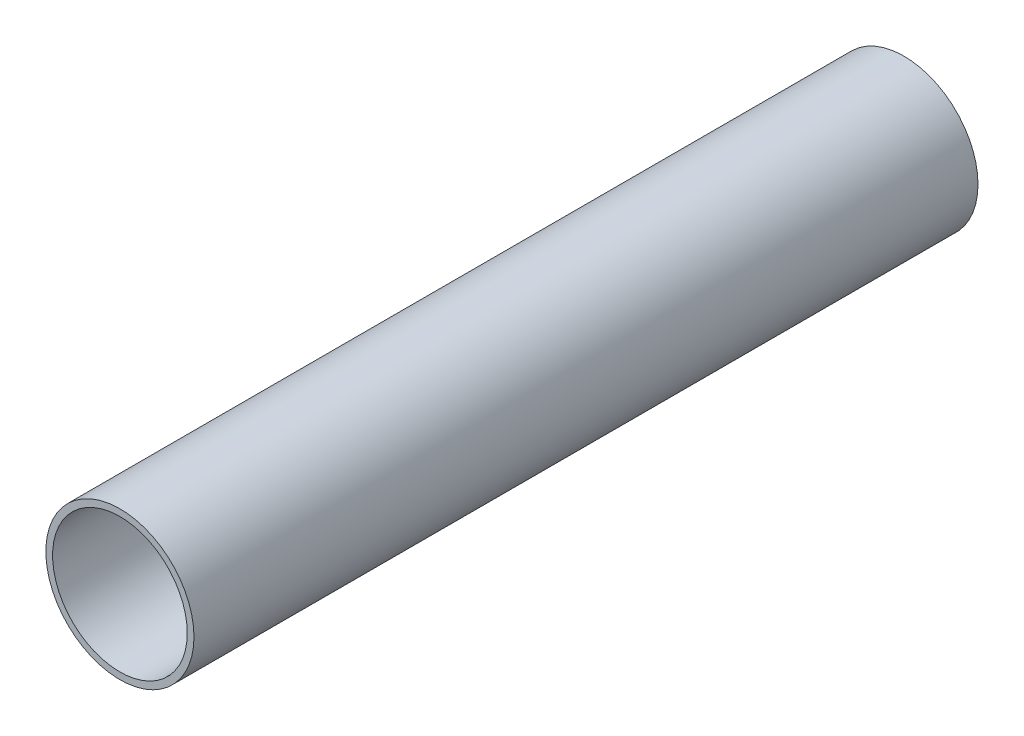
ISO-10303-21;
HEADER;
FILE_DESCRIPTION(('STEP AP214'),'2;1');
FILE_NAME('part.step','',(''),(''),'','','');
FILE_SCHEMA(('AUTOMOTIVE_DESIGN { 1 0 10303 214 1 1 1 1 }'));
ENDSEC;
DATA;
#1=APPLICATION_CONTEXT('core data for automotive mechanical design processes');
#2=APPLICATION_PROTOCOL_DEFINITION('international standard','automotive_design',2000,#1);
#3=PRODUCT_CONTEXT('',#1,'mechanical');
#4=PRODUCT('Part','Part','',(#3));
#5=PRODUCT_RELATED_PRODUCT_CATEGORY('part','',(#4));
#6=PRODUCT_DEFINITION_FORMATION('','',#4);
#7=PRODUCT_DEFINITION_CONTEXT('part definition',#1,'design');
#8=PRODUCT_DEFINITION('design','',#6,#7);
#9=PRODUCT_DEFINITION_SHAPE('','',#8);
#10=(LENGTH_UNIT() NAMED_UNIT(*) SI_UNIT(.MILLI.,.METRE.));
#11=(NAMED_UNIT(*) PLANE_ANGLE_UNIT() SI_UNIT($,.RADIAN.));
#12=(NAMED_UNIT(*) SI_UNIT($,.STERADIAN.) SOLID_ANGLE_UNIT());
#13=UNCERTAINTY_MEASURE_WITH_UNIT(LENGTH_MEASURE(1.E-05),#10,'distance_accuracy_value','');
#14=(GEOMETRIC_REPRESENTATION_CONTEXT(3) GLOBAL_UNCERTAINTY_ASSIGNED_CONTEXT((#13)) GLOBAL_UNIT_ASSIGNED_CONTEXT((#10,
#11,#12)) REPRESENTATION_CONTEXT('',''));
#15=CARTESIAN_POINT('',(0.,0.,0.));
#16=DIRECTION('',(0.,0.,1.));
#17=DIRECTION('',(1.,0.,0.));
#18=AXIS2_PLACEMENT_3D('',#15,#16,#17);
#19=CARTESIAN_POINT('',(0.,0.,73.95));
#20=DIRECTION('',(0.,0.,1.));
#21=DIRECTION('',(1.,0.,0.));
#22=AXIS2_PLACEMENT_3D('',#19,#20,#21);
#23=PLANE('',#22);
#24=CARTESIAN_POINT('',(0.,0.,73.95));
#25=DIRECTION('',(0.,0.,1.));
#26=DIRECTION('',(1.,0.,0.));
#27=AXIS2_PLACEMENT_3D('',#24,#25,#26);
#28=CIRCLE('',#27,13.97);
#29=CARTESIAN_POINT('',(13.97,0.,73.95));
#30=VERTEX_POINT('',#29);
#31=EDGE_CURVE('E10',#30,#30,#28,.T.);
#32=ORIENTED_EDGE('',*,*,#31,.T.);
#33=EDGE_LOOP('',(#32));
#34=FACE_BOUND('',#33,.T.);
#35=CARTESIAN_POINT('',(0.,0.,73.95));
#36=DIRECTION('',(0.,0.,1.));
#37=DIRECTION('',(1.,0.,0.));
#38=AXIS2_PLACEMENT_3D('',#35,#36,#37);
#39=CIRCLE('',#38,12.7);
#40=CARTESIAN_POINT('',(12.7,0.,73.95));
#41=VERTEX_POINT('',#40);
#42=EDGE_CURVE('E43',#41,#41,#39,.T.);
#43=ORIENTED_EDGE('',*,*,#42,.F.);
#44=EDGE_LOOP('',(#43));
#45=FACE_BOUND('',#44,.T.);
#46=ADVANCED_FACE('F32',(#34,#45),#23,.T.);
#47=CARTESIAN_POINT('',(0.,0.,-73.95));
#48=DIRECTION('',(0.,0.,1.));
#49=DIRECTION('',(1.,0.,0.));
#50=AXIS2_PLACEMENT_3D('',#47,#48,#49);
#51=PLANE('',#50);
#52=CARTESIAN_POINT('',(0.,0.,-73.95));
#53=DIRECTION('',(0.,0.,1.));
#54=DIRECTION('',(1.,0.,0.));
#55=AXIS2_PLACEMENT_3D('',#52,#53,#54);
#56=CIRCLE('',#55,13.97);
#57=CARTESIAN_POINT('',(13.97,0.,-73.95));
#58=VERTEX_POINT('',#57);
#59=EDGE_CURVE('E36',#58,#58,#56,.T.);
#60=ORIENTED_EDGE('',*,*,#59,.F.);
#61=EDGE_LOOP('',(#60));
#62=FACE_BOUND('',#61,.T.);
#63=CARTESIAN_POINT('',(0.,0.,-73.95));
#64=DIRECTION('',(0.,0.,1.));
#65=DIRECTION('',(1.,0.,0.));
#66=AXIS2_PLACEMENT_3D('',#63,#64,#65);
#67=CIRCLE('',#66,12.7);
#68=CARTESIAN_POINT('',(12.7,0.,-73.95));
#69=VERTEX_POINT('',#68);
#70=EDGE_CURVE('E45',#69,#69,#67,.T.);
#71=ORIENTED_EDGE('',*,*,#70,.T.);
#72=EDGE_LOOP('',(#71));
#73=FACE_BOUND('',#72,.T.);
#74=ADVANCED_FACE('F55',(#62,#73),#51,.F.);
#75=CARTESIAN_POINT('',(0.,0.,73.95));
#76=DIRECTION('',(0.,0.,-1.));
#77=DIRECTION('',(-1.,0.,0.));
#78=AXIS2_PLACEMENT_3D('',#75,#76,#77);
#79=CYLINDRICAL_SURFACE('',#78,13.97);
#80=ORIENTED_EDGE('',*,*,#31,.F.);
#81=EDGE_LOOP('',(#80));
#82=FACE_BOUND('',#81,.T.);
#83=ORIENTED_EDGE('',*,*,#59,.T.);
#84=EDGE_LOOP('',(#83));
#85=FACE_BOUND('',#84,.T.);
#86=ADVANCED_FACE('F34',(#82,#85),#79,.T.);
#87=CARTESIAN_POINT('',(0.,0.,73.95));
#88=DIRECTION('',(0.,0.,-1.));
#89=DIRECTION('',(-1.,0.,0.));
#90=AXIS2_PLACEMENT_3D('',#87,#88,#89);
#91=CYLINDRICAL_SURFACE('',#90,12.7);
#92=ORIENTED_EDGE('',*,*,#42,.T.);
#93=EDGE_LOOP('',(#92));
#94=FACE_BOUND('',#93,.T.);
#95=ORIENTED_EDGE('',*,*,#70,.F.);
#96=EDGE_LOOP('',(#95));
#97=FACE_BOUND('',#96,.T.);
#98=ADVANCED_FACE('F51',(#94,#97),#91,.F.);
#99=CLOSED_SHELL('',(#46,#74,#86,#98));
#100=MANIFOLD_SOLID_BREP('B2',#99);
#101=ADVANCED_BREP_SHAPE_REPRESENTATION('',(#18,#100),#14);
#102=SHAPE_DEFINITION_REPRESENTATION(#9,#101);
ENDSEC;
END-ISO-10303-21;
